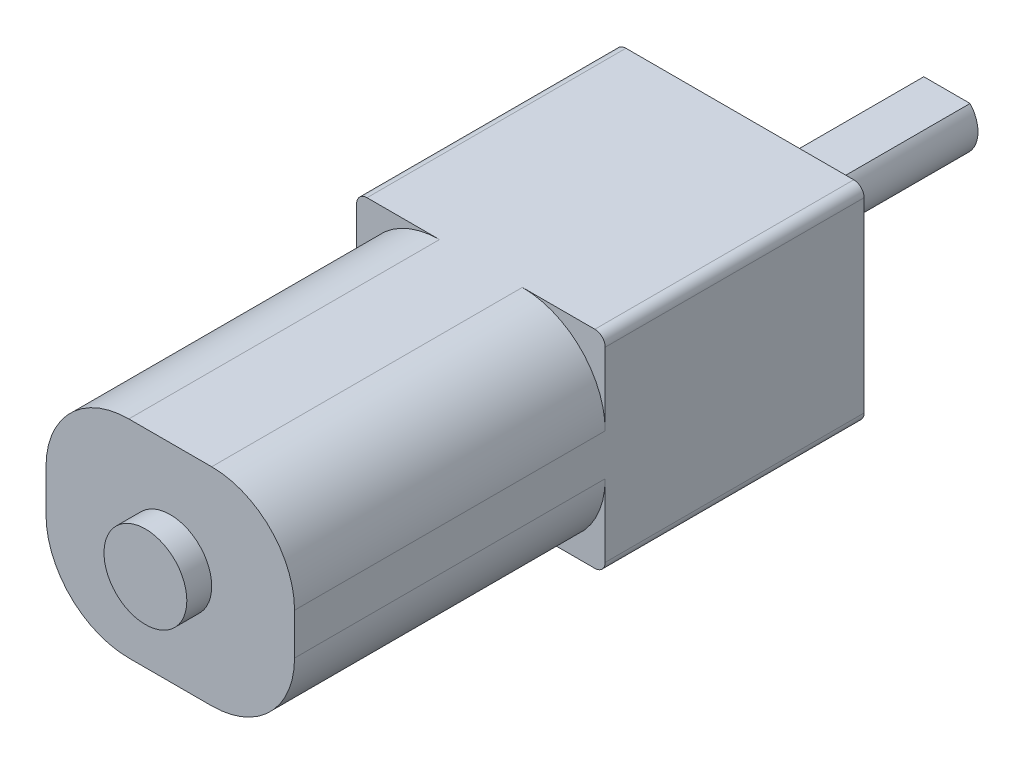
ISO-10303-21;
HEADER;
FILE_DESCRIPTION(('STEP AP214'),'2;1');
FILE_NAME('part.step','',(''),(''),'','','');
FILE_SCHEMA(('AUTOMOTIVE_DESIGN { 1 0 10303 214 1 1 1 1 }'));
ENDSEC;
DATA;
#1=APPLICATION_CONTEXT('core data for automotive mechanical design processes');
#2=APPLICATION_PROTOCOL_DEFINITION('international standard','automotive_design',2000,#1);
#3=PRODUCT_CONTEXT('',#1,'mechanical');
#4=PRODUCT('Part','Part','',(#3));
#5=PRODUCT_RELATED_PRODUCT_CATEGORY('part','',(#4));
#6=PRODUCT_DEFINITION_FORMATION('','',#4);
#7=PRODUCT_DEFINITION_CONTEXT('part definition',#1,'design');
#8=PRODUCT_DEFINITION('design','',#6,#7);
#9=PRODUCT_DEFINITION_SHAPE('','',#8);
#10=(LENGTH_UNIT() NAMED_UNIT(*) SI_UNIT(.MILLI.,.METRE.));
#11=(NAMED_UNIT(*) PLANE_ANGLE_UNIT() SI_UNIT($,.RADIAN.));
#12=(NAMED_UNIT(*) SI_UNIT($,.STERADIAN.) SOLID_ANGLE_UNIT());
#13=UNCERTAINTY_MEASURE_WITH_UNIT(LENGTH_MEASURE(1.E-05),#10,'distance_accuracy_value','');
#14=(GEOMETRIC_REPRESENTATION_CONTEXT(3) GLOBAL_UNCERTAINTY_ASSIGNED_CONTEXT((#13)) GLOBAL_UNIT_ASSIGNED_CONTEXT((#10,
#11,#12)) REPRESENTATION_CONTEXT('',''));
#15=CARTESIAN_POINT('',(0.,0.,0.));
#16=DIRECTION('',(0.,0.,1.));
#17=DIRECTION('',(1.,0.,0.));
#18=AXIS2_PLACEMENT_3D('',#15,#16,#17);
#19=CARTESIAN_POINT('',(0.,0.,15.));
#20=DIRECTION('',(1.,0.,0.));
#21=DIRECTION('',(0.,1.,0.));
#22=AXIS2_PLACEMENT_3D('',#19,#20,#21);
#23=PLANE('',#22);
#24=DIRECTION('',(0.,-1.,0.));
#25=VECTOR('',#24,1.);
#26=CARTESIAN_POINT('',(0.,0.,-12.5));
#27=LINE('',#26,#25);
#28=CARTESIAN_POINT('',(0.,9.5,-12.5));
#29=VERTEX_POINT('',#28);
#30=CARTESIAN_POINT('',(0.,0.5,-12.5));
#31=VERTEX_POINT('',#30);
#32=EDGE_CURVE('E189',#29,#31,#27,.T.);
#33=ORIENTED_EDGE('',*,*,#32,.T.);
#34=DIRECTION('',(0.,0.,1.));
#35=VECTOR('',#34,1.);
#36=CARTESIAN_POINT('',(0.,0.5,15.));
#37=LINE('',#36,#35);
#38=CARTESIAN_POINT('',(0.,0.5,0.));
#39=VERTEX_POINT('',#38);
#40=EDGE_CURVE('E285',#31,#39,#37,.T.);
#41=ORIENTED_EDGE('',*,*,#40,.T.);
#42=DIRECTION('',(0.,-1.,0.));
#43=VECTOR('',#42,1.);
#44=CARTESIAN_POINT('',(0.,0.,0.));
#45=LINE('',#44,#43);
#46=CARTESIAN_POINT('',(0.,4.,0.));
#47=VERTEX_POINT('',#46);
#48=EDGE_CURVE('E179',#47,#39,#45,.T.);
#49=ORIENTED_EDGE('',*,*,#48,.F.);
#50=DIRECTION('',(0.,0.,-1.));
#51=VECTOR('',#50,1.);
#52=CARTESIAN_POINT('',(0.,4.,15.));
#53=LINE('',#52,#51);
#54=CARTESIAN_POINT('',(0.,4.,15.));
#55=VERTEX_POINT('',#54);
#56=EDGE_CURVE('E244',#47,#55,#53,.F.);
#57=ORIENTED_EDGE('',*,*,#56,.T.);
#58=DIRECTION('',(0.,-1.,0.));
#59=VECTOR('',#58,1.);
#60=CARTESIAN_POINT('',(0.,0.,15.));
#61=LINE('',#60,#59);
#62=CARTESIAN_POINT('',(0.,6.,15.));
#63=VERTEX_POINT('',#62);
#64=EDGE_CURVE('E202',#63,#55,#61,.T.);
#65=ORIENTED_EDGE('',*,*,#64,.F.);
#66=DIRECTION('',(0.,0.,-1.));
#67=VECTOR('',#66,1.);
#68=CARTESIAN_POINT('',(0.,6.,15.));
#69=LINE('',#68,#67);
#70=CARTESIAN_POINT('',(0.,6.,0.));
#71=VERTEX_POINT('',#70);
#72=EDGE_CURVE('E241',#63,#71,#69,.T.);
#73=ORIENTED_EDGE('',*,*,#72,.T.);
#74=CARTESIAN_POINT('',(0.,9.5,0.));
#75=VERTEX_POINT('',#74);
#76=EDGE_CURVE('E203',#75,#71,#45,.T.);
#77=ORIENTED_EDGE('',*,*,#76,.F.);
#78=DIRECTION('',(0.,0.,1.));
#79=VECTOR('',#78,1.);
#80=CARTESIAN_POINT('',(0.,9.5,15.));
#81=LINE('',#80,#79);
#82=EDGE_CURVE('E283',#75,#29,#81,.F.);
#83=ORIENTED_EDGE('',*,*,#82,.T.);
#84=EDGE_LOOP('',(#33,#41,#49,#57,#65,#73,#77,#83));
#85=FACE_BOUND('',#84,.T.);
#86=ADVANCED_FACE('F34',(#85),#23,.F.);
#87=CARTESIAN_POINT('',(0.,0.,15.));
#88=DIRECTION('',(0.,1.,0.));
#89=DIRECTION('',(0.,0.,1.));
#90=AXIS2_PLACEMENT_3D('',#87,#88,#89);
#91=PLANE('',#90);
#92=DIRECTION('',(1.,0.,0.));
#93=VECTOR('',#92,1.);
#94=CARTESIAN_POINT('',(0.,0.,-12.5));
#95=LINE('',#94,#93);
#96=CARTESIAN_POINT('',(0.5,0.,-12.5));
#97=VERTEX_POINT('',#96);
#98=CARTESIAN_POINT('',(11.5,0.,-12.5));
#99=VERTEX_POINT('',#98);
#100=EDGE_CURVE('E192',#97,#99,#95,.T.);
#101=ORIENTED_EDGE('',*,*,#100,.T.);
#102=DIRECTION('',(0.,0.,1.));
#103=VECTOR('',#102,1.);
#104=CARTESIAN_POINT('',(11.5,0.,15.));
#105=LINE('',#104,#103);
#106=CARTESIAN_POINT('',(11.5,0.,0.));
#107=VERTEX_POINT('',#106);
#108=EDGE_CURVE('E265',#99,#107,#105,.T.);
#109=ORIENTED_EDGE('',*,*,#108,.T.);
#110=DIRECTION('',(1.,0.,0.));
#111=VECTOR('',#110,1.);
#112=CARTESIAN_POINT('',(0.,0.,0.));
#113=LINE('',#112,#111);
#114=CARTESIAN_POINT('',(8.,0.,0.));
#115=VERTEX_POINT('',#114);
#116=EDGE_CURVE('E205',#115,#107,#113,.T.);
#117=ORIENTED_EDGE('',*,*,#116,.F.);
#118=DIRECTION('',(0.,0.,-1.));
#119=VECTOR('',#118,1.);
#120=CARTESIAN_POINT('',(8.,0.,15.));
#121=LINE('',#120,#119);
#122=CARTESIAN_POINT('',(8.,0.,15.));
#123=VERTEX_POINT('',#122);
#124=EDGE_CURVE('E224',#115,#123,#121,.F.);
#125=ORIENTED_EDGE('',*,*,#124,.T.);
#126=DIRECTION('',(1.,0.,0.));
#127=VECTOR('',#126,1.);
#128=CARTESIAN_POINT('',(0.,0.,15.));
#129=LINE('',#128,#127);
#130=CARTESIAN_POINT('',(4.,0.,15.));
#131=VERTEX_POINT('',#130);
#132=EDGE_CURVE('E215',#131,#123,#129,.T.);
#133=ORIENTED_EDGE('',*,*,#132,.F.);
#134=DIRECTION('',(0.,0.,-1.));
#135=VECTOR('',#134,1.);
#136=CARTESIAN_POINT('',(4.,0.,15.));
#137=LINE('',#136,#135);
#138=CARTESIAN_POINT('',(4.,0.,0.));
#139=VERTEX_POINT('',#138);
#140=EDGE_CURVE('E226',#131,#139,#137,.T.);
#141=ORIENTED_EDGE('',*,*,#140,.T.);
#142=CARTESIAN_POINT('',(0.5,0.,0.));
#143=VERTEX_POINT('',#142);
#144=EDGE_CURVE('E206',#143,#139,#113,.T.);
#145=ORIENTED_EDGE('',*,*,#144,.F.);
#146=DIRECTION('',(0.,0.,1.));
#147=VECTOR('',#146,1.);
#148=CARTESIAN_POINT('',(0.5,0.,15.));
#149=LINE('',#148,#147);
#150=EDGE_CURVE('E263',#143,#97,#149,.F.);
#151=ORIENTED_EDGE('',*,*,#150,.T.);
#152=EDGE_LOOP('',(#101,#109,#117,#125,#133,#141,#145,#151));
#153=FACE_BOUND('',#152,.T.);
#154=ADVANCED_FACE('F327',(#153),#91,.F.);
#155=CARTESIAN_POINT('',(12.,0.,15.));
#156=DIRECTION('',(-1.,0.,0.));
#157=DIRECTION('',(0.,-1.,0.));
#158=AXIS2_PLACEMENT_3D('',#155,#156,#157);
#159=PLANE('',#158);
#160=DIRECTION('',(0.,1.,0.));
#161=VECTOR('',#160,1.);
#162=CARTESIAN_POINT('',(12.,0.,0.));
#163=LINE('',#162,#161);
#164=CARTESIAN_POINT('',(12.,0.5,0.));
#165=VERTEX_POINT('',#164);
#166=CARTESIAN_POINT('',(12.,4.,0.));
#167=VERTEX_POINT('',#166);
#168=EDGE_CURVE('E209',#165,#167,#163,.T.);
#169=ORIENTED_EDGE('',*,*,#168,.F.);
#170=DIRECTION('',(0.,0.,1.));
#171=VECTOR('',#170,1.);
#172=CARTESIAN_POINT('',(12.,0.5,15.));
#173=LINE('',#172,#171);
#174=CARTESIAN_POINT('',(12.,0.5,-12.5));
#175=VERTEX_POINT('',#174);
#176=EDGE_CURVE('E273',#165,#175,#173,.F.);
#177=ORIENTED_EDGE('',*,*,#176,.T.);
#178=DIRECTION('',(0.,1.,0.));
#179=VECTOR('',#178,1.);
#180=CARTESIAN_POINT('',(12.,0.,-12.5));
#181=LINE('',#180,#179);
#182=CARTESIAN_POINT('',(12.,9.5,-12.5));
#183=VERTEX_POINT('',#182);
#184=EDGE_CURVE('E196',#175,#183,#181,.T.);
#185=ORIENTED_EDGE('',*,*,#184,.T.);
#186=DIRECTION('',(0.,0.,1.));
#187=VECTOR('',#186,1.);
#188=CARTESIAN_POINT('',(12.,9.5,15.));
#189=LINE('',#188,#187);
#190=CARTESIAN_POINT('',(12.,9.5,0.));
#191=VERTEX_POINT('',#190);
#192=EDGE_CURVE('E270',#183,#191,#189,.T.);
#193=ORIENTED_EDGE('',*,*,#192,.T.);
#194=CARTESIAN_POINT('',(12.,6.,0.));
#195=VERTEX_POINT('',#194);
#196=EDGE_CURVE('E208',#195,#191,#163,.T.);
#197=ORIENTED_EDGE('',*,*,#196,.F.);
#198=DIRECTION('',(0.,0.,-1.));
#199=VECTOR('',#198,1.);
#200=CARTESIAN_POINT('',(12.,6.,15.));
#201=LINE('',#200,#199);
#202=CARTESIAN_POINT('',(12.,6.,15.));
#203=VERTEX_POINT('',#202);
#204=EDGE_CURVE('E259',#195,#203,#201,.F.);
#205=ORIENTED_EDGE('',*,*,#204,.T.);
#206=DIRECTION('',(0.,1.,0.));
#207=VECTOR('',#206,1.);
#208=CARTESIAN_POINT('',(12.,0.,15.));
#209=LINE('',#208,#207);
#210=CARTESIAN_POINT('',(12.,4.,15.));
#211=VERTEX_POINT('',#210);
#212=EDGE_CURVE('E218',#211,#203,#209,.T.);
#213=ORIENTED_EDGE('',*,*,#212,.F.);
#214=DIRECTION('',(0.,0.,-1.));
#215=VECTOR('',#214,1.);
#216=CARTESIAN_POINT('',(12.,4.,15.));
#217=LINE('',#216,#215);
#218=EDGE_CURVE('E188',#211,#167,#217,.T.);
#219=ORIENTED_EDGE('',*,*,#218,.T.);
#220=EDGE_LOOP('',(#169,#177,#185,#193,#197,#205,#213,#219));
#221=FACE_BOUND('',#220,.T.);
#222=ADVANCED_FACE('F318',(#221),#159,.F.);
#223=CARTESIAN_POINT('',(0.,10.,15.));
#224=DIRECTION('',(0.,-1.,0.));
#225=DIRECTION('',(0.,0.,-1.));
#226=AXIS2_PLACEMENT_3D('',#223,#224,#225);
#227=PLANE('',#226);
#228=DIRECTION('',(-1.,0.,0.));
#229=VECTOR('',#228,1.);
#230=CARTESIAN_POINT('',(0.,10.,-12.5));
#231=LINE('',#230,#229);
#232=CARTESIAN_POINT('',(11.5,10.,-12.5));
#233=VERTEX_POINT('',#232);
#234=CARTESIAN_POINT('',(0.499999999999997,10.,-12.5));
#235=VERTEX_POINT('',#234);
#236=EDGE_CURVE('E199',#233,#235,#231,.T.);
#237=ORIENTED_EDGE('',*,*,#236,.T.);
#238=DIRECTION('',(0.,0.,1.));
#239=VECTOR('',#238,1.);
#240=CARTESIAN_POINT('',(0.499999999999997,10.,15.));
#241=LINE('',#240,#239);
#242=CARTESIAN_POINT('',(0.499999999999997,10.,0.));
#243=VERTEX_POINT('',#242);
#244=EDGE_CURVE('E292',#235,#243,#241,.T.);
#245=ORIENTED_EDGE('',*,*,#244,.T.);
#246=DIRECTION('',(-1.,0.,0.));
#247=VECTOR('',#246,1.);
#248=CARTESIAN_POINT('',(0.,10.,0.));
#249=LINE('',#248,#247);
#250=CARTESIAN_POINT('',(4.,10.,0.));
#251=VERTEX_POINT('',#250);
#252=EDGE_CURVE('E211',#251,#243,#249,.T.);
#253=ORIENTED_EDGE('',*,*,#252,.F.);
#254=DIRECTION('',(0.,0.,-1.));
#255=VECTOR('',#254,1.);
#256=CARTESIAN_POINT('',(4.,10.,15.));
#257=LINE('',#256,#255);
#258=CARTESIAN_POINT('',(4.,10.,15.));
#259=VERTEX_POINT('',#258);
#260=EDGE_CURVE('E257',#251,#259,#257,.F.);
#261=ORIENTED_EDGE('',*,*,#260,.T.);
#262=DIRECTION('',(-1.,0.,0.));
#263=VECTOR('',#262,1.);
#264=CARTESIAN_POINT('',(0.,10.,15.));
#265=LINE('',#264,#263);
#266=CARTESIAN_POINT('',(8.,10.,15.));
#267=VERTEX_POINT('',#266);
#268=EDGE_CURVE('E221',#267,#259,#265,.T.);
#269=ORIENTED_EDGE('',*,*,#268,.F.);
#270=DIRECTION('',(0.,0.,-1.));
#271=VECTOR('',#270,1.);
#272=CARTESIAN_POINT('',(8.,10.,15.));
#273=LINE('',#272,#271);
#274=CARTESIAN_POINT('',(8.,10.,0.));
#275=VERTEX_POINT('',#274);
#276=EDGE_CURVE('E254',#267,#275,#273,.T.);
#277=ORIENTED_EDGE('',*,*,#276,.T.);
#278=CARTESIAN_POINT('',(11.5,10.,0.));
#279=VERTEX_POINT('',#278);
#280=EDGE_CURVE('E193',#279,#275,#249,.T.);
#281=ORIENTED_EDGE('',*,*,#280,.F.);
#282=DIRECTION('',(0.,0.,1.));
#283=VECTOR('',#282,1.);
#284=CARTESIAN_POINT('',(11.5,10.,15.));
#285=LINE('',#284,#283);
#286=EDGE_CURVE('E290',#279,#233,#285,.F.);
#287=ORIENTED_EDGE('',*,*,#286,.T.);
#288=EDGE_LOOP('',(#237,#245,#253,#261,#269,#277,#281,#287));
#289=FACE_BOUND('',#288,.T.);
#290=ADVANCED_FACE('F311',(#289),#227,.F.);
#291=CARTESIAN_POINT('',(0.,0.,15.));
#292=DIRECTION('',(0.,0.,-1.));
#293=DIRECTION('',(-1.,0.,0.));
#294=AXIS2_PLACEMENT_3D('',#291,#292,#293);
#295=PLANE('',#294);
#296=CARTESIAN_POINT('',(6.,5.,15.));
#297=DIRECTION('',(0.,0.,1.));
#298=DIRECTION('',(1.,0.,0.));
#299=AXIS2_PLACEMENT_3D('',#296,#297,#298);
#300=CIRCLE('',#299,2.);
#301=CARTESIAN_POINT('',(8.,5.,15.));
#302=VERTEX_POINT('',#301);
#303=EDGE_CURVE('E187',#302,#302,#300,.T.);
#304=ORIENTED_EDGE('',*,*,#303,.F.);
#305=EDGE_LOOP('',(#304));
#306=FACE_BOUND('',#305,.T.);
#307=ORIENTED_EDGE('',*,*,#64,.T.);
#308=CARTESIAN_POINT('',(4.,4.,15.));
#309=DIRECTION('',(0.,0.,-1.));
#310=DIRECTION('',(-1.,0.,0.));
#311=AXIS2_PLACEMENT_3D('',#308,#309,#310);
#312=CIRCLE('',#311,4.);
#313=EDGE_CURVE('E252',#55,#131,#312,.F.);
#314=ORIENTED_EDGE('',*,*,#313,.T.);
#315=ORIENTED_EDGE('',*,*,#132,.T.);
#316=CARTESIAN_POINT('',(8.,4.,15.));
#317=DIRECTION('',(0.,0.,-1.));
#318=DIRECTION('',(-1.,0.,0.));
#319=AXIS2_PLACEMENT_3D('',#316,#317,#318);
#320=CIRCLE('',#319,4.);
#321=EDGE_CURVE('E248',#123,#211,#320,.F.);
#322=ORIENTED_EDGE('',*,*,#321,.T.);
#323=ORIENTED_EDGE('',*,*,#212,.T.);
#324=CARTESIAN_POINT('',(8.,6.,15.));
#325=DIRECTION('',(0.,0.,-1.));
#326=DIRECTION('',(-1.,0.,0.));
#327=AXIS2_PLACEMENT_3D('',#324,#325,#326);
#328=CIRCLE('',#327,4.);
#329=EDGE_CURVE('E246',#203,#267,#328,.F.);
#330=ORIENTED_EDGE('',*,*,#329,.T.);
#331=ORIENTED_EDGE('',*,*,#268,.T.);
#332=CARTESIAN_POINT('',(4.,6.,15.));
#333=DIRECTION('',(0.,0.,-1.));
#334=DIRECTION('',(-1.,0.,0.));
#335=AXIS2_PLACEMENT_3D('',#332,#333,#334);
#336=CIRCLE('',#335,4.);
#337=EDGE_CURVE('E250',#259,#63,#336,.F.);
#338=ORIENTED_EDGE('',*,*,#337,.T.);
#339=EDGE_LOOP('',(#307,#314,#315,#322,#323,#330,#331,#338));
#340=FACE_BOUND('',#339,.T.);
#341=ADVANCED_FACE('F347',(#306,#340),#295,.F.);
#342=CARTESIAN_POINT('',(4.,4.,15.));
#343=DIRECTION('',(0.,0.,-1.));
#344=DIRECTION('',(-1.,0.,0.));
#345=AXIS2_PLACEMENT_3D('',#342,#343,#344);
#346=CYLINDRICAL_SURFACE('',#345,4.);
#347=ORIENTED_EDGE('',*,*,#313,.F.);
#348=ORIENTED_EDGE('',*,*,#56,.F.);
#349=CARTESIAN_POINT('',(4.,4.,0.));
#350=DIRECTION('',(0.,0.,-1.));
#351=DIRECTION('',(-1.,0.,0.));
#352=AXIS2_PLACEMENT_3D('',#349,#350,#351);
#353=CIRCLE('',#352,4.);
#354=EDGE_CURVE('E238',#139,#47,#353,.T.);
#355=ORIENTED_EDGE('',*,*,#354,.F.);
#356=ORIENTED_EDGE('',*,*,#140,.F.);
#357=EDGE_LOOP('',(#347,#348,#355,#356));
#358=FACE_BOUND('',#357,.T.);
#359=ADVANCED_FACE('F343',(#358),#346,.T.);
#360=CARTESIAN_POINT('',(4.,6.,15.));
#361=DIRECTION('',(0.,0.,-1.));
#362=DIRECTION('',(-1.,0.,0.));
#363=AXIS2_PLACEMENT_3D('',#360,#361,#362);
#364=CYLINDRICAL_SURFACE('',#363,4.);
#365=ORIENTED_EDGE('',*,*,#337,.F.);
#366=ORIENTED_EDGE('',*,*,#260,.F.);
#367=CARTESIAN_POINT('',(4.,6.,0.));
#368=DIRECTION('',(0.,0.,-1.));
#369=DIRECTION('',(-1.,0.,0.));
#370=AXIS2_PLACEMENT_3D('',#367,#368,#369);
#371=CIRCLE('',#370,4.);
#372=EDGE_CURVE('E235',#71,#251,#371,.T.);
#373=ORIENTED_EDGE('',*,*,#372,.F.);
#374=ORIENTED_EDGE('',*,*,#72,.F.);
#375=EDGE_LOOP('',(#365,#366,#373,#374));
#376=FACE_BOUND('',#375,.T.);
#377=ADVANCED_FACE('F361',(#376),#364,.T.);
#378=CARTESIAN_POINT('',(8.,4.,15.));
#379=DIRECTION('',(0.,0.,-1.));
#380=DIRECTION('',(-1.,0.,0.));
#381=AXIS2_PLACEMENT_3D('',#378,#379,#380);
#382=CYLINDRICAL_SURFACE('',#381,4.);
#383=ORIENTED_EDGE('',*,*,#321,.F.);
#384=ORIENTED_EDGE('',*,*,#124,.F.);
#385=CARTESIAN_POINT('',(8.,4.,0.));
#386=DIRECTION('',(0.,0.,-1.));
#387=DIRECTION('',(-1.,0.,0.));
#388=AXIS2_PLACEMENT_3D('',#385,#386,#387);
#389=CIRCLE('',#388,4.);
#390=EDGE_CURVE('E232',#167,#115,#389,.T.);
#391=ORIENTED_EDGE('',*,*,#390,.F.);
#392=ORIENTED_EDGE('',*,*,#218,.F.);
#393=EDGE_LOOP('',(#383,#384,#391,#392));
#394=FACE_BOUND('',#393,.T.);
#395=ADVANCED_FACE('F351',(#394),#382,.T.);
#396=CARTESIAN_POINT('',(8.,6.,15.));
#397=DIRECTION('',(0.,0.,-1.));
#398=DIRECTION('',(-1.,0.,0.));
#399=AXIS2_PLACEMENT_3D('',#396,#397,#398);
#400=CYLINDRICAL_SURFACE('',#399,4.);
#401=ORIENTED_EDGE('',*,*,#329,.F.);
#402=ORIENTED_EDGE('',*,*,#204,.F.);
#403=CARTESIAN_POINT('',(8.,6.,0.));
#404=DIRECTION('',(0.,0.,-1.));
#405=DIRECTION('',(-1.,0.,0.));
#406=AXIS2_PLACEMENT_3D('',#403,#404,#405);
#407=CIRCLE('',#406,4.);
#408=EDGE_CURVE('E229',#275,#195,#407,.T.);
#409=ORIENTED_EDGE('',*,*,#408,.F.);
#410=ORIENTED_EDGE('',*,*,#276,.F.);
#411=EDGE_LOOP('',(#401,#402,#409,#410));
#412=FACE_BOUND('',#411,.T.);
#413=ADVANCED_FACE('F357',(#412),#400,.T.);
#414=CARTESIAN_POINT('',(0.,0.,0.));
#415=DIRECTION('',(0.,0.,-1.));
#416=DIRECTION('',(-1.,0.,0.));
#417=AXIS2_PLACEMENT_3D('',#414,#415,#416);
#418=PLANE('',#417);
#419=ORIENTED_EDGE('',*,*,#48,.T.);
#420=CARTESIAN_POINT('',(0.5,0.5,0.));
#421=DIRECTION('',(0.,0.,-1.));
#422=DIRECTION('',(-1.,0.,0.));
#423=AXIS2_PLACEMENT_3D('',#420,#421,#422);
#424=CIRCLE('',#423,0.5);
#425=EDGE_CURVE('E288',#39,#143,#424,.F.);
#426=ORIENTED_EDGE('',*,*,#425,.T.);
#427=ORIENTED_EDGE('',*,*,#144,.T.);
#428=ORIENTED_EDGE('',*,*,#354,.T.);
#429=EDGE_LOOP('',(#419,#426,#427,#428));
#430=FACE_BOUND('',#429,.T.);
#431=ADVANCED_FACE('F338',(#430),#418,.F.);
#432=ORIENTED_EDGE('',*,*,#252,.T.);
#433=CARTESIAN_POINT('',(0.499999999999997,9.5,0.));
#434=DIRECTION('',(0.,0.,-1.));
#435=DIRECTION('',(-1.,0.,0.));
#436=AXIS2_PLACEMENT_3D('',#433,#434,#435);
#437=CIRCLE('',#436,0.5);
#438=EDGE_CURVE('E42',#243,#75,#437,.F.);
#439=ORIENTED_EDGE('',*,*,#438,.T.);
#440=ORIENTED_EDGE('',*,*,#76,.T.);
#441=ORIENTED_EDGE('',*,*,#372,.T.);
#442=EDGE_LOOP('',(#432,#439,#440,#441));
#443=FACE_BOUND('',#442,.T.);
#444=ADVANCED_FACE('F296',(#443),#418,.F.);
#445=ORIENTED_EDGE('',*,*,#196,.T.);
#446=CARTESIAN_POINT('',(11.5,9.5,0.));
#447=DIRECTION('',(0.,0.,-1.));
#448=DIRECTION('',(-1.,0.,0.));
#449=AXIS2_PLACEMENT_3D('',#446,#447,#448);
#450=CIRCLE('',#449,0.5);
#451=EDGE_CURVE('E11',#191,#279,#450,.F.);
#452=ORIENTED_EDGE('',*,*,#451,.T.);
#453=ORIENTED_EDGE('',*,*,#280,.T.);
#454=ORIENTED_EDGE('',*,*,#408,.T.);
#455=EDGE_LOOP('',(#445,#452,#453,#454));
#456=FACE_BOUND('',#455,.T.);
#457=ADVANCED_FACE('F389',(#456),#418,.F.);
#458=CARTESIAN_POINT('',(0.,0.,-12.5));
#459=DIRECTION('',(0.,0.,-1.));
#460=DIRECTION('',(-1.,0.,0.));
#461=AXIS2_PLACEMENT_3D('',#458,#459,#460);
#462=PLANE('',#461);
#463=CARTESIAN_POINT('',(10.5,5.,-12.5));
#464=DIRECTION('',(0.,0.,-1.));
#465=DIRECTION('',(-1.,0.,0.));
#466=AXIS2_PLACEMENT_3D('',#463,#464,#465);
#467=CIRCLE('',#466,0.800000000000001);
#468=CARTESIAN_POINT('',(9.7,5.,-12.5));
#469=VERTEX_POINT('',#468);
#470=EDGE_CURVE('E447',#469,#469,#467,.T.);
#471=ORIENTED_EDGE('',*,*,#470,.F.);
#472=EDGE_LOOP('',(#471));
#473=FACE_BOUND('',#472,.T.);
#474=CARTESIAN_POINT('',(1.5,5.,-12.5));
#475=DIRECTION('',(0.,0.,-1.));
#476=DIRECTION('',(-1.,0.,0.));
#477=AXIS2_PLACEMENT_3D('',#474,#475,#476);
#478=CIRCLE('',#477,0.8);
#479=CARTESIAN_POINT('',(0.699999999999997,5.,-12.5));
#480=VERTEX_POINT('',#479);
#481=EDGE_CURVE('E436',#480,#480,#478,.T.);
#482=ORIENTED_EDGE('',*,*,#481,.F.);
#483=EDGE_LOOP('',(#482));
#484=FACE_BOUND('',#483,.T.);
#485=CARTESIAN_POINT('',(6.,5.,-12.5));
#486=DIRECTION('',(0.,0.,-1.));
#487=DIRECTION('',(-1.,0.,0.));
#488=AXIS2_PLACEMENT_3D('',#485,#486,#487);
#489=CIRCLE('',#488,2.);
#490=CARTESIAN_POINT('',(4.,5.,-12.5));
#491=VERTEX_POINT('',#490);
#492=EDGE_CURVE('E184',#491,#491,#489,.T.);
#493=ORIENTED_EDGE('',*,*,#492,.F.);
#494=EDGE_LOOP('',(#493));
#495=FACE_BOUND('',#494,.T.);
#496=ORIENTED_EDGE('',*,*,#184,.F.);
#497=CARTESIAN_POINT('',(11.5,0.5,-12.5));
#498=DIRECTION('',(0.,0.,-1.));
#499=DIRECTION('',(-1.,0.,0.));
#500=AXIS2_PLACEMENT_3D('',#497,#498,#499);
#501=CIRCLE('',#500,0.5);
#502=EDGE_CURVE('E281',#175,#99,#501,.T.);
#503=ORIENTED_EDGE('',*,*,#502,.T.);
#504=ORIENTED_EDGE('',*,*,#100,.F.);
#505=CARTESIAN_POINT('',(0.5,0.5,-12.5));
#506=DIRECTION('',(0.,0.,-1.));
#507=DIRECTION('',(-1.,0.,0.));
#508=AXIS2_PLACEMENT_3D('',#505,#506,#507);
#509=CIRCLE('',#508,0.5);
#510=EDGE_CURVE('E279',#97,#31,#509,.T.);
#511=ORIENTED_EDGE('',*,*,#510,.T.);
#512=ORIENTED_EDGE('',*,*,#32,.F.);
#513=CARTESIAN_POINT('',(0.499999999999997,9.5,-12.5));
#514=DIRECTION('',(0.,0.,-1.));
#515=DIRECTION('',(-1.,0.,0.));
#516=AXIS2_PLACEMENT_3D('',#513,#514,#515);
#517=CIRCLE('',#516,0.5);
#518=EDGE_CURVE('E277',#29,#235,#517,.T.);
#519=ORIENTED_EDGE('',*,*,#518,.T.);
#520=ORIENTED_EDGE('',*,*,#236,.F.);
#521=CARTESIAN_POINT('',(11.5,9.5,-12.5));
#522=DIRECTION('',(0.,0.,-1.));
#523=DIRECTION('',(-1.,0.,0.));
#524=AXIS2_PLACEMENT_3D('',#521,#522,#523);
#525=CIRCLE('',#524,0.5);
#526=EDGE_CURVE('E275',#233,#183,#525,.T.);
#527=ORIENTED_EDGE('',*,*,#526,.T.);
#528=EDGE_LOOP('',(#496,#503,#504,#511,#512,#519,#520,#527));
#529=FACE_BOUND('',#528,.T.);
#530=ADVANCED_FACE('F308',(#473,#484,#495,#529),#462,.T.);
#531=ORIENTED_EDGE('',*,*,#116,.T.);
#532=CARTESIAN_POINT('',(11.5,0.5,0.));
#533=DIRECTION('',(0.,0.,-1.));
#534=DIRECTION('',(-1.,0.,0.));
#535=AXIS2_PLACEMENT_3D('',#532,#533,#534);
#536=CIRCLE('',#535,0.5);
#537=EDGE_CURVE('E268',#107,#165,#536,.F.);
#538=ORIENTED_EDGE('',*,*,#537,.T.);
#539=ORIENTED_EDGE('',*,*,#168,.T.);
#540=ORIENTED_EDGE('',*,*,#390,.T.);
#541=EDGE_LOOP('',(#531,#538,#539,#540));
#542=FACE_BOUND('',#541,.T.);
#543=ADVANCED_FACE('F384',(#542),#418,.F.);
#544=CARTESIAN_POINT('',(6.,5.,-13.2));
#545=DIRECTION('',(0.,0.,1.));
#546=DIRECTION('',(1.,0.,0.));
#547=AXIS2_PLACEMENT_3D('',#544,#545,#546);
#548=CYLINDRICAL_SURFACE('',#547,2.);
#549=CARTESIAN_POINT('',(6.,5.,-13.2));
#550=DIRECTION('',(0.,0.,-1.));
#551=DIRECTION('',(-1.,0.,0.));
#552=AXIS2_PLACEMENT_3D('',#549,#550,#551);
#553=CIRCLE('',#552,2.);
#554=CARTESIAN_POINT('',(4.,5.,-13.2));
#555=VERTEX_POINT('',#554);
#556=EDGE_CURVE('E176',#555,#555,#553,.T.);
#557=ORIENTED_EDGE('',*,*,#556,.F.);
#558=EDGE_LOOP('',(#557));
#559=FACE_BOUND('',#558,.T.);
#560=ORIENTED_EDGE('',*,*,#492,.T.);
#561=EDGE_LOOP('',(#560));
#562=FACE_BOUND('',#561,.T.);
#563=ADVANCED_FACE('F387',(#559,#562),#548,.T.);
#564=CARTESIAN_POINT('',(6.,5.,-13.2));
#565=DIRECTION('',(0.,0.,-1.));
#566=DIRECTION('',(-1.,0.,0.));
#567=AXIS2_PLACEMENT_3D('',#564,#565,#566);
#568=PLANE('',#567);
#569=CARTESIAN_POINT('',(6.,5.,-13.2));
#570=DIRECTION('',(0.,0.,-1.));
#571=DIRECTION('',(-1.,0.,0.));
#572=AXIS2_PLACEMENT_3D('',#569,#570,#571);
#573=CIRCLE('',#572,1.5);
#574=CARTESIAN_POINT('',(7.11803398874989,6.,-13.2));
#575=VERTEX_POINT('',#574);
#576=CARTESIAN_POINT('',(4.8819660112501,6.,-13.2));
#577=VERTEX_POINT('',#576);
#578=EDGE_CURVE('E175',#575,#577,#573,.T.);
#579=ORIENTED_EDGE('',*,*,#578,.F.);
#580=DIRECTION('',(1.,0.,0.));
#581=VECTOR('',#580,1.);
#582=CARTESIAN_POINT('',(7.11803398874989,6.,-13.2));
#583=LINE('',#582,#581);
#584=EDGE_CURVE('E172',#577,#575,#583,.T.);
#585=ORIENTED_EDGE('',*,*,#584,.F.);
#586=EDGE_LOOP('',(#579,#585));
#587=FACE_BOUND('',#586,.T.);
#588=ORIENTED_EDGE('',*,*,#556,.T.);
#589=EDGE_LOOP('',(#588));
#590=FACE_BOUND('',#589,.T.);
#591=ADVANCED_FACE('F395',(#587,#590),#568,.T.);
#592=CARTESIAN_POINT('',(6.,5.,-22.5));
#593=DIRECTION('',(0.,0.,1.));
#594=DIRECTION('',(1.,0.,0.));
#595=AXIS2_PLACEMENT_3D('',#592,#593,#594);
#596=CYLINDRICAL_SURFACE('',#595,1.5);
#597=ORIENTED_EDGE('',*,*,#578,.T.);
#598=DIRECTION('',(0.,0.,1.));
#599=VECTOR('',#598,1.);
#600=CARTESIAN_POINT('',(4.8819660112501,6.,-22.5));
#601=LINE('',#600,#599);
#602=CARTESIAN_POINT('',(4.8819660112501,6.,-22.5));
#603=VERTEX_POINT('',#602);
#604=EDGE_CURVE('E162',#603,#577,#601,.T.);
#605=ORIENTED_EDGE('',*,*,#604,.F.);
#606=CARTESIAN_POINT('',(6.,5.,-22.5));
#607=DIRECTION('',(0.,0.,-1.));
#608=DIRECTION('',(-1.,0.,0.));
#609=AXIS2_PLACEMENT_3D('',#606,#607,#608);
#610=CIRCLE('',#609,1.5);
#611=CARTESIAN_POINT('',(7.11803398874989,6.,-22.5));
#612=VERTEX_POINT('',#611);
#613=EDGE_CURVE('E168',#612,#603,#610,.T.);
#614=ORIENTED_EDGE('',*,*,#613,.F.);
#615=DIRECTION('',(0.,0.,1.));
#616=VECTOR('',#615,1.);
#617=CARTESIAN_POINT('',(7.11803398874989,6.,-22.5));
#618=LINE('',#617,#616);
#619=EDGE_CURVE('E165',#612,#575,#618,.T.);
#620=ORIENTED_EDGE('',*,*,#619,.T.);
#621=EDGE_LOOP('',(#597,#605,#614,#620));
#622=FACE_BOUND('',#621,.T.);
#623=ADVANCED_FACE('F174',(#622),#596,.T.);
#624=CARTESIAN_POINT('',(7.11803398874989,6.,-22.5));
#625=DIRECTION('',(0.,-1.,0.));
#626=DIRECTION('',(0.,0.,-1.));
#627=AXIS2_PLACEMENT_3D('',#624,#625,#626);
#628=PLANE('',#627);
#629=ORIENTED_EDGE('',*,*,#584,.T.);
#630=ORIENTED_EDGE('',*,*,#619,.F.);
#631=DIRECTION('',(1.,0.,0.));
#632=VECTOR('',#631,1.);
#633=CARTESIAN_POINT('',(7.11803398874989,6.,-22.5));
#634=LINE('',#633,#632);
#635=EDGE_CURVE('E157',#603,#612,#634,.T.);
#636=ORIENTED_EDGE('',*,*,#635,.F.);
#637=ORIENTED_EDGE('',*,*,#604,.T.);
#638=EDGE_LOOP('',(#629,#630,#636,#637));
#639=FACE_BOUND('',#638,.T.);
#640=ADVANCED_FACE('F160',(#639),#628,.F.);
#641=CARTESIAN_POINT('',(6.,5.,-22.5));
#642=DIRECTION('',(0.,0.,-1.));
#643=DIRECTION('',(-1.,0.,0.));
#644=AXIS2_PLACEMENT_3D('',#641,#642,#643);
#645=PLANE('',#644);
#646=ORIENTED_EDGE('',*,*,#613,.T.);
#647=ORIENTED_EDGE('',*,*,#635,.T.);
#648=EDGE_LOOP('',(#646,#647));
#649=FACE_BOUND('',#648,.T.);
#650=ADVANCED_FACE('F170',(#649),#645,.T.);
#651=CARTESIAN_POINT('',(1.5,5.,-10.5));
#652=DIRECTION('',(0.,0.,-1.));
#653=DIRECTION('',(-1.,0.,0.));
#654=AXIS2_PLACEMENT_3D('',#651,#652,#653);
#655=CYLINDRICAL_SURFACE('',#654,0.8);
#656=CARTESIAN_POINT('',(1.5,5.,-10.5));
#657=DIRECTION('',(0.,0.,-1.));
#658=DIRECTION('',(-1.,0.,0.));
#659=AXIS2_PLACEMENT_3D('',#656,#657,#658);
#660=CIRCLE('',#659,0.8);
#661=CARTESIAN_POINT('',(0.699999999999997,5.,-10.5));
#662=VERTEX_POINT('',#661);
#663=EDGE_CURVE('E439',#662,#662,#660,.T.);
#664=ORIENTED_EDGE('',*,*,#663,.F.);
#665=EDGE_LOOP('',(#664));
#666=FACE_BOUND('',#665,.T.);
#667=ORIENTED_EDGE('',*,*,#481,.T.);
#668=EDGE_LOOP('',(#667));
#669=FACE_BOUND('',#668,.T.);
#670=ADVANCED_FACE('F406',(#666,#669),#655,.F.);
#671=CARTESIAN_POINT('',(1.5,5.,-10.5));
#672=DIRECTION('',(0.,0.,-1.));
#673=DIRECTION('',(-1.,0.,0.));
#674=AXIS2_PLACEMENT_3D('',#671,#672,#673);
#675=PLANE('',#674);
#676=ORIENTED_EDGE('',*,*,#663,.T.);
#677=EDGE_LOOP('',(#676));
#678=FACE_BOUND('',#677,.T.);
#679=ADVANCED_FACE('F409',(#678),#675,.T.);
#680=CARTESIAN_POINT('',(10.5,5.,-10.5));
#681=DIRECTION('',(0.,0.,-1.));
#682=DIRECTION('',(-1.,0.,0.));
#683=AXIS2_PLACEMENT_3D('',#680,#681,#682);
#684=CYLINDRICAL_SURFACE('',#683,0.800000000000001);
#685=CARTESIAN_POINT('',(10.5,5.,-10.5));
#686=DIRECTION('',(0.,0.,-1.));
#687=DIRECTION('',(-1.,0.,0.));
#688=AXIS2_PLACEMENT_3D('',#685,#686,#687);
#689=CIRCLE('',#688,0.800000000000001);
#690=CARTESIAN_POINT('',(9.7,5.,-10.5));
#691=VERTEX_POINT('',#690);
#692=EDGE_CURVE('E444',#691,#691,#689,.T.);
#693=ORIENTED_EDGE('',*,*,#692,.F.);
#694=EDGE_LOOP('',(#693));
#695=FACE_BOUND('',#694,.T.);
#696=ORIENTED_EDGE('',*,*,#470,.T.);
#697=EDGE_LOOP('',(#696));
#698=FACE_BOUND('',#697,.T.);
#699=ADVANCED_FACE('F413',(#695,#698),#684,.F.);
#700=CARTESIAN_POINT('',(10.5,5.,-10.5));
#701=DIRECTION('',(0.,0.,-1.));
#702=DIRECTION('',(-1.,0.,0.));
#703=AXIS2_PLACEMENT_3D('',#700,#701,#702);
#704=PLANE('',#703);
#705=ORIENTED_EDGE('',*,*,#692,.T.);
#706=EDGE_LOOP('',(#705));
#707=FACE_BOUND('',#706,.T.);
#708=ADVANCED_FACE('F417',(#707),#704,.T.);
#709=CARTESIAN_POINT('',(6.,5.,16.2));
#710=DIRECTION('',(0.,0.,-1.));
#711=DIRECTION('',(-1.,0.,0.));
#712=AXIS2_PLACEMENT_3D('',#709,#710,#711);
#713=CYLINDRICAL_SURFACE('',#712,2.);
#714=CARTESIAN_POINT('',(6.,5.,16.2));
#715=DIRECTION('',(0.,0.,1.));
#716=DIRECTION('',(1.,0.,0.));
#717=AXIS2_PLACEMENT_3D('',#714,#715,#716);
#718=CIRCLE('',#717,2.);
#719=CARTESIAN_POINT('',(8.,5.,16.2));
#720=VERTEX_POINT('',#719);
#721=EDGE_CURVE('E435',#720,#720,#718,.T.);
#722=ORIENTED_EDGE('',*,*,#721,.F.);
#723=EDGE_LOOP('',(#722));
#724=FACE_BOUND('',#723,.T.);
#725=ORIENTED_EDGE('',*,*,#303,.T.);
#726=EDGE_LOOP('',(#725));
#727=FACE_BOUND('',#726,.T.);
#728=ADVANCED_FACE('F421',(#724,#727),#713,.T.);
#729=CARTESIAN_POINT('',(6.,5.,16.2));
#730=DIRECTION('',(0.,0.,1.));
#731=DIRECTION('',(1.,0.,0.));
#732=AXIS2_PLACEMENT_3D('',#729,#730,#731);
#733=PLANE('',#732);
#734=ORIENTED_EDGE('',*,*,#721,.T.);
#735=EDGE_LOOP('',(#734));
#736=FACE_BOUND('',#735,.T.);
#737=ADVANCED_FACE('F425',(#736),#733,.T.);
#738=CARTESIAN_POINT('',(11.5,0.5,15.));
#739=DIRECTION('',(0.,0.,1.));
#740=DIRECTION('',(1.,0.,0.));
#741=AXIS2_PLACEMENT_3D('',#738,#739,#740);
#742=CYLINDRICAL_SURFACE('',#741,0.5);
#743=ORIENTED_EDGE('',*,*,#502,.F.);
#744=ORIENTED_EDGE('',*,*,#176,.F.);
#745=ORIENTED_EDGE('',*,*,#537,.F.);
#746=ORIENTED_EDGE('',*,*,#108,.F.);
#747=EDGE_LOOP('',(#743,#744,#745,#746));
#748=FACE_BOUND('',#747,.T.);
#749=ADVANCED_FACE('F322',(#748),#742,.T.);
#750=CARTESIAN_POINT('',(0.5,0.5,15.));
#751=DIRECTION('',(0.,0.,1.));
#752=DIRECTION('',(1.,0.,0.));
#753=AXIS2_PLACEMENT_3D('',#750,#751,#752);
#754=CYLINDRICAL_SURFACE('',#753,0.5);
#755=ORIENTED_EDGE('',*,*,#510,.F.);
#756=ORIENTED_EDGE('',*,*,#150,.F.);
#757=ORIENTED_EDGE('',*,*,#425,.F.);
#758=ORIENTED_EDGE('',*,*,#40,.F.);
#759=EDGE_LOOP('',(#755,#756,#757,#758));
#760=FACE_BOUND('',#759,.T.);
#761=ADVANCED_FACE('F333',(#760),#754,.T.);
#762=CARTESIAN_POINT('',(0.499999999999997,9.5,15.));
#763=DIRECTION('',(0.,0.,1.));
#764=DIRECTION('',(1.,0.,0.));
#765=AXIS2_PLACEMENT_3D('',#762,#763,#764);
#766=CYLINDRICAL_SURFACE('',#765,0.5);
#767=ORIENTED_EDGE('',*,*,#518,.F.);
#768=ORIENTED_EDGE('',*,*,#82,.F.);
#769=ORIENTED_EDGE('',*,*,#438,.F.);
#770=ORIENTED_EDGE('',*,*,#244,.F.);
#771=EDGE_LOOP('',(#767,#768,#769,#770));
#772=FACE_BOUND('',#771,.T.);
#773=ADVANCED_FACE('F304',(#772),#766,.T.);
#774=CARTESIAN_POINT('',(11.5,9.5,15.));
#775=DIRECTION('',(0.,0.,1.));
#776=DIRECTION('',(1.,0.,0.));
#777=AXIS2_PLACEMENT_3D('',#774,#775,#776);
#778=CYLINDRICAL_SURFACE('',#777,0.5);
#779=ORIENTED_EDGE('',*,*,#526,.F.);
#780=ORIENTED_EDGE('',*,*,#286,.F.);
#781=ORIENTED_EDGE('',*,*,#451,.F.);
#782=ORIENTED_EDGE('',*,*,#192,.F.);
#783=EDGE_LOOP('',(#779,#780,#781,#782));
#784=FACE_BOUND('',#783,.T.);
#785=ADVANCED_FACE('F36',(#784),#778,.T.);
#786=CLOSED_SHELL('',(#86,#154,#222,#290,#341,#359,#377,#395,#413,#431,#444,#457,#530,#543,#563,
#591,#623,#640,#650,#670,#679,#699,#708,#728,#737,#749,#761,#773,#785));
#787=MANIFOLD_SOLID_BREP('B2',#786);
#788=ADVANCED_BREP_SHAPE_REPRESENTATION('',(#18,#787),#14);
#789=SHAPE_DEFINITION_REPRESENTATION(#9,#788);
ENDSEC;
END-ISO-10303-21;
